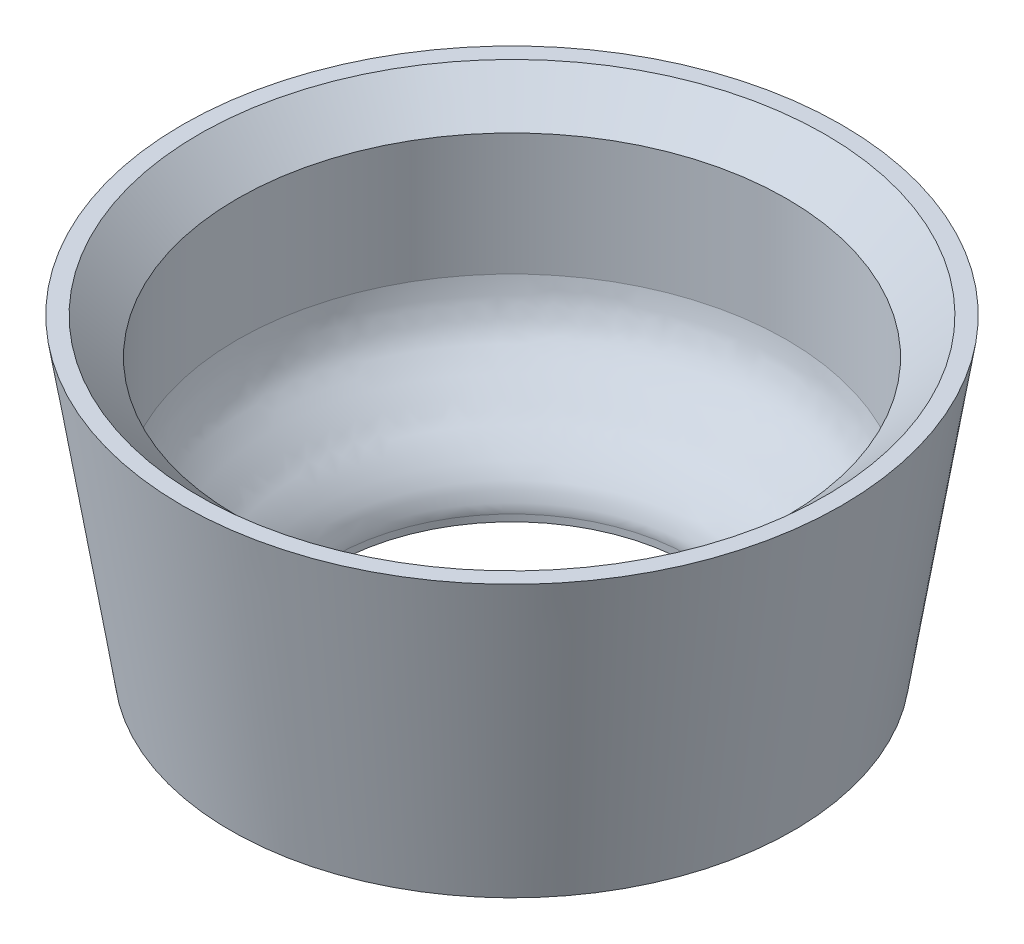
ISO-10303-21;
HEADER;
FILE_DESCRIPTION(('STEP AP214'),'2;1');
FILE_NAME('part.step','',(''),(''),'','','');
FILE_SCHEMA(('AUTOMOTIVE_DESIGN { 1 0 10303 214 1 1 1 1 }'));
ENDSEC;
DATA;
#1=APPLICATION_CONTEXT('core data for automotive mechanical design processes');
#2=APPLICATION_PROTOCOL_DEFINITION('international standard','automotive_design',2000,#1);
#3=PRODUCT_CONTEXT('',#1,'mechanical');
#4=PRODUCT('Part','Part','',(#3));
#5=PRODUCT_RELATED_PRODUCT_CATEGORY('part','',(#4));
#6=PRODUCT_DEFINITION_FORMATION('','',#4);
#7=PRODUCT_DEFINITION_CONTEXT('part definition',#1,'design');
#8=PRODUCT_DEFINITION('design','',#6,#7);
#9=PRODUCT_DEFINITION_SHAPE('','',#8);
#10=(LENGTH_UNIT() NAMED_UNIT(*) SI_UNIT(.MILLI.,.METRE.));
#11=(NAMED_UNIT(*) PLANE_ANGLE_UNIT() SI_UNIT($,.RADIAN.));
#12=(NAMED_UNIT(*) SI_UNIT($,.STERADIAN.) SOLID_ANGLE_UNIT());
#13=UNCERTAINTY_MEASURE_WITH_UNIT(LENGTH_MEASURE(1.E-05),#10,'distance_accuracy_value','');
#14=(GEOMETRIC_REPRESENTATION_CONTEXT(3) GLOBAL_UNCERTAINTY_ASSIGNED_CONTEXT((#13)) GLOBAL_UNIT_ASSIGNED_CONTEXT((#10,
#11,#12)) REPRESENTATION_CONTEXT('',''));
#15=CARTESIAN_POINT('',(0.,0.,0.));
#16=DIRECTION('',(0.,0.,1.));
#17=DIRECTION('',(1.,0.,0.));
#18=AXIS2_PLACEMENT_3D('',#15,#16,#17);
#19=CARTESIAN_POINT('',(0.,0.,0.));
#20=DIRECTION('',(0.,-1.,0.));
#21=DIRECTION('',(0.,0.,-1.));
#22=AXIS2_PLACEMENT_3D('',#19,#20,#21);
#23=CYLINDRICAL_SURFACE('',#22,26.3877562004198);
#24=CARTESIAN_POINT('',(0.,273.977978151893,9.56588997971305E-13));
#25=DIRECTION('',(0.,-1.,0.));
#26=DIRECTION('',(0.,0.,-1.));
#27=AXIS2_PLACEMENT_3D('',#24,#25,#26);
#28=CIRCLE('',#27,26.3877562004198);
#29=CARTESIAN_POINT('',(0.,273.977978151893,-26.3877562004189));
#30=VERTEX_POINT('',#29);
#31=EDGE_CURVE('E10',#30,#30,#28,.T.);
#32=ORIENTED_EDGE('',*,*,#31,.T.);
#33=EDGE_LOOP('',(#32));
#34=FACE_BOUND('',#33,.T.);
#35=CARTESIAN_POINT('',(0.,274.97797815188,9.60080479310103E-13));
#36=DIRECTION('',(0.,-1.,0.));
#37=DIRECTION('',(0.,0.,-1.));
#38=AXIS2_PLACEMENT_3D('',#35,#36,#37);
#39=CIRCLE('',#38,26.3877562004198);
#40=CARTESIAN_POINT('',(0.,274.97797815188,-26.3877562004189));
#41=VERTEX_POINT('',#40);
#42=EDGE_CURVE('E57',#41,#41,#39,.T.);
#43=ORIENTED_EDGE('',*,*,#42,.F.);
#44=EDGE_LOOP('',(#43));
#45=FACE_BOUND('',#44,.T.);
#46=ADVANCED_FACE('F32',(#34,#45),#23,.F.);
#47=CARTESIAN_POINT('',(0.,273.977978151893,-26.3877562004189));
#48=DIRECTION('',(0.,-1.,0.));
#49=DIRECTION('',(0.,0.,-1.));
#50=AXIS2_PLACEMENT_3D('',#47,#48,#49);
#51=PLANE('',#50);
#52=CARTESIAN_POINT('',(0.,273.977978151893,9.56588997971305E-13));
#53=DIRECTION('',(0.,-1.,0.));
#54=DIRECTION('',(0.,0.,-1.));
#55=AXIS2_PLACEMENT_3D('',#52,#53,#54);
#56=CIRCLE('',#55,41.3938487490565);
#57=CARTESIAN_POINT('',(0.,273.977978151893,-41.3938487490556));
#58=VERTEX_POINT('',#57);
#59=EDGE_CURVE('E38',#58,#58,#56,.T.);
#60=ORIENTED_EDGE('',*,*,#59,.T.);
#61=EDGE_LOOP('',(#60));
#62=FACE_BOUND('',#61,.T.);
#63=ORIENTED_EDGE('',*,*,#31,.F.);
#64=EDGE_LOOP('',(#63));
#65=FACE_BOUND('',#64,.T.);
#66=ADVANCED_FACE('F85',(#62,#65),#51,.T.);
#67=CARTESIAN_POINT('',(0.,273.977978151893,9.56588997971305E-13));
#68=DIRECTION('',(0.,1.,0.));
#69=DIRECTION('',(0.,0.,1.));
#70=AXIS2_PLACEMENT_3D('',#67,#68,#69);
#71=CONICAL_SURFACE('',#70,41.3938487490565,0.157079632680188);
#72=CARTESIAN_POINT('',(0.,318.979376236805,1.11371053960663E-12));
#73=DIRECTION('',(0.,-1.,0.));
#74=DIRECTION('',(0.,0.,-1.));
#75=AXIS2_PLACEMENT_3D('',#72,#73,#74);
#76=CIRCLE('',#75,48.5213699985892);
#77=CARTESIAN_POINT('',(0.,318.979376236805,-48.5213699985881));
#78=VERTEX_POINT('',#77);
#79=EDGE_CURVE('E42',#78,#78,#76,.T.);
#80=ORIENTED_EDGE('',*,*,#79,.T.);
#81=EDGE_LOOP('',(#80));
#82=FACE_BOUND('',#81,.T.);
#83=ORIENTED_EDGE('',*,*,#59,.F.);
#84=EDGE_LOOP('',(#83));
#85=FACE_BOUND('',#84,.T.);
#86=ADVANCED_FACE('F82',(#82,#85),#71,.T.);
#87=CARTESIAN_POINT('',(0.,318.979376236805,-46.0927877598137));
#88=DIRECTION('',(0.,1.,0.));
#89=DIRECTION('',(0.,0.,1.));
#90=AXIS2_PLACEMENT_3D('',#87,#88,#89);
#91=PLANE('',#90);
#92=CARTESIAN_POINT('',(0.,318.979376236805,1.11371053960663E-12));
#93=DIRECTION('',(0.,-1.,0.));
#94=DIRECTION('',(0.,0.,-1.));
#95=AXIS2_PLACEMENT_3D('',#92,#93,#94);
#96=CIRCLE('',#95,46.0927877598148);
#97=CARTESIAN_POINT('',(0.,318.979376236805,-46.0927877598137));
#98=VERTEX_POINT('',#97);
#99=EDGE_CURVE('E46',#98,#98,#96,.T.);
#100=ORIENTED_EDGE('',*,*,#99,.T.);
#101=EDGE_LOOP('',(#100));
#102=FACE_BOUND('',#101,.T.);
#103=ORIENTED_EDGE('',*,*,#79,.F.);
#104=EDGE_LOOP('',(#103));
#105=FACE_BOUND('',#104,.T.);
#106=ADVANCED_FACE('F78',(#102,#105),#91,.T.);
#107=CARTESIAN_POINT('',(0.,318.979376236805,1.11371053960663E-12));
#108=DIRECTION('',(0.,1.,0.));
#109=DIRECTION('',(0.,0.,1.));
#110=AXIS2_PLACEMENT_3D('',#107,#108,#109);
#111=CONICAL_SURFACE('',#110,46.0927877598148,0.811578102177097);
#112=CARTESIAN_POINT('',(0.,313.610335114398,1.09496463272026E-12));
#113=DIRECTION('',(0.,-1.,0.));
#114=DIRECTION('',(0.,0.,-1.));
#115=AXIS2_PLACEMENT_3D('',#112,#113,#114);
#116=CIRCLE('',#115,40.4349989332098);
#117=CARTESIAN_POINT('',(0.,313.610335114399,-40.4349989332087));
#118=VERTEX_POINT('',#117);
#119=EDGE_CURVE('E51',#118,#118,#116,.T.);
#120=ORIENTED_EDGE('',*,*,#119,.T.);
#121=EDGE_LOOP('',(#120));
#122=FACE_BOUND('',#121,.T.);
#123=ORIENTED_EDGE('',*,*,#99,.F.);
#124=EDGE_LOOP('',(#123));
#125=FACE_BOUND('',#124,.T.);
#126=ADVANCED_FACE('F74',(#122,#125),#111,.F.);
#127=CARTESIAN_POINT('',(0.,0.,0.));
#128=DIRECTION('',(0.,-1.,0.));
#129=DIRECTION('',(0.,0.,-1.));
#130=AXIS2_PLACEMENT_3D('',#127,#128,#129);
#131=CYLINDRICAL_SURFACE('',#130,40.4350000000003);
#132=CARTESIAN_POINT('',(0.,295.628098891423,1.03217999051707E-12));
#133=DIRECTION('',(0.,-1.,0.));
#134=DIRECTION('',(0.,0.,-1.));
#135=AXIS2_PLACEMENT_3D('',#132,#133,#134);
#136=CIRCLE('',#135,40.4350010667908);
#137=CARTESIAN_POINT('',(0.,295.628098891423,-40.4350010667898));
#138=VERTEX_POINT('',#137);
#139=EDGE_CURVE('E54',#138,#138,#136,.T.);
#140=ORIENTED_EDGE('',*,*,#139,.T.);
#141=EDGE_LOOP('',(#140));
#142=FACE_BOUND('',#141,.T.);
#143=ORIENTED_EDGE('',*,*,#119,.F.);
#144=EDGE_LOOP('',(#143));
#145=FACE_BOUND('',#144,.T.);
#146=ADVANCED_FACE('F70',(#142,#145),#131,.F.);
#147=CARTESIAN_POINT('',(0.,295.628098891423,-40.4350010667898));
#148=CARTESIAN_POINT('',(0.,294.71918657136,-40.2647234528202));
#149=CARTESIAN_POINT('',(0.,293.371695278649,-40.0879686355818));
#150=CARTESIAN_POINT('',(0.,291.690068116743,-39.4094903095561));
#151=CARTESIAN_POINT('',(0.,290.459887566534,-38.9018516808407));
#152=CARTESIAN_POINT('',(0.,289.239215423858,-38.1417561102302));
#153=CARTESIAN_POINT('',(0.,288.22794334762,-37.2195001967667));
#154=CARTESIAN_POINT('',(0.,287.265101834698,-36.2232085349721));
#155=CARTESIAN_POINT('',(0.,286.251458493227,-35.2740472846284));
#156=CARTESIAN_POINT('',(0.,285.346264322064,-34.131062379519));
#157=CARTESIAN_POINT('',(0.,284.296585872457,-33.1232553669501));
#158=CARTESIAN_POINT('',(0.,283.286750944138,-32.1701319487847));
#159=CARTESIAN_POINT('',(0.,282.438718877549,-31.0668156665143));
#160=CARTESIAN_POINT('',(0.,281.464372876016,-30.1741822058091));
#161=CARTESIAN_POINT('',(0.,280.515150439004,-29.1604144206059));
#162=CARTESIAN_POINT('',(0.,279.511909602148,-28.3566998106437));
#163=CARTESIAN_POINT('',(0.,278.556908895579,-27.4437816168175));
#164=CARTESIAN_POINT('',(0.,277.028730659966,-26.7968306616541));
#165=CARTESIAN_POINT('',(0.,275.85671053562,-26.3080695843668));
#166=CARTESIAN_POINT('',(0.,274.97797815188,-26.3877562004189));
#167=B_SPLINE_CURVE_WITH_KNOTS('',3,(#147,#148,#149,#150,#151,#152,#153,#154,#155,#156,#157,
#158,#159,#160,#161,#162,#163,#164,#165,#166),.UNSPECIFIED.,.F.,.F.,(4,1,1,1,1,1,1,1,1,1,1,1,1,
1,1,1,1,4),(0.,0.10867224794744,0.156309524502418,0.211225256633363,0.263823637183203,
0.323095790357063,0.370409458617588,0.425603494595034,0.484875283664825,0.540072311394556,
0.595269720852049,0.646674739775672,0.701870225342411,0.749181962842129,0.808452499104919,
0.85200223902209,0.901872117172349,1.),.UNSPECIFIED.);
#168=CARTESIAN_POINT('',(0.,0.,0.));
#169=DIRECTION('',(0.,-1.,0.));
#170=AXIS1_PLACEMENT('',#168,#169);
#171=SURFACE_OF_REVOLUTION('',#167,#170);
#172=ORIENTED_EDGE('',*,*,#42,.T.);
#173=EDGE_LOOP('',(#172));
#174=FACE_BOUND('',#173,.T.);
#175=ORIENTED_EDGE('',*,*,#139,.F.);
#176=EDGE_LOOP('',(#175));
#177=FACE_BOUND('',#176,.T.);
#178=ADVANCED_FACE('F67',(#174,#177),#171,.F.);
#179=CLOSED_SHELL('',(#46,#66,#86,#106,#126,#146,#178));
#180=MANIFOLD_SOLID_BREP('B2',#179);
#181=ADVANCED_BREP_SHAPE_REPRESENTATION('',(#18,#180),#14);
#182=SHAPE_DEFINITION_REPRESENTATION(#9,#181);
ENDSEC;
END-ISO-10303-21;
